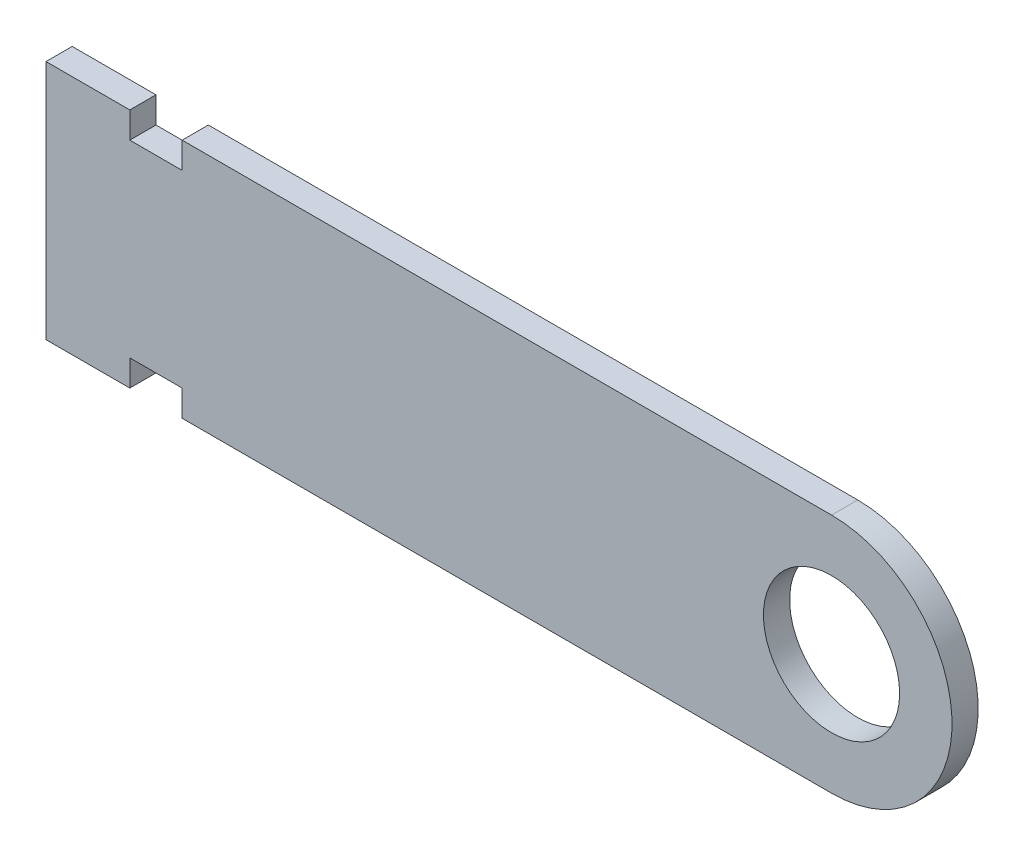
ISO-10303-21;
HEADER;
FILE_DESCRIPTION(('STEP AP214'),'2;1');
FILE_NAME('part.step','',(''),(''),'','','');
FILE_SCHEMA(('AUTOMOTIVE_DESIGN { 1 0 10303 214 1 1 1 1 }'));
ENDSEC;
DATA;
#1=APPLICATION_CONTEXT('core data for automotive mechanical design processes');
#2=APPLICATION_PROTOCOL_DEFINITION('international standard','automotive_design',2000,#1);
#3=PRODUCT_CONTEXT('',#1,'mechanical');
#4=PRODUCT('Part','Part','',(#3));
#5=PRODUCT_RELATED_PRODUCT_CATEGORY('part','',(#4));
#6=PRODUCT_DEFINITION_FORMATION('','',#4);
#7=PRODUCT_DEFINITION_CONTEXT('part definition',#1,'design');
#8=PRODUCT_DEFINITION('design','',#6,#7);
#9=PRODUCT_DEFINITION_SHAPE('','',#8);
#10=(LENGTH_UNIT() NAMED_UNIT(*) SI_UNIT(.MILLI.,.METRE.));
#11=(NAMED_UNIT(*) PLANE_ANGLE_UNIT() SI_UNIT($,.RADIAN.));
#12=(NAMED_UNIT(*) SI_UNIT($,.STERADIAN.) SOLID_ANGLE_UNIT());
#13=UNCERTAINTY_MEASURE_WITH_UNIT(LENGTH_MEASURE(1.E-05),#10,'distance_accuracy_value','');
#14=(GEOMETRIC_REPRESENTATION_CONTEXT(3) GLOBAL_UNCERTAINTY_ASSIGNED_CONTEXT((#13)) GLOBAL_UNIT_ASSIGNED_CONTEXT((#10,
#11,#12)) REPRESENTATION_CONTEXT('',''));
#15=CARTESIAN_POINT('',(0.,0.,0.));
#16=DIRECTION('',(0.,0.,1.));
#17=DIRECTION('',(1.,0.,0.));
#18=AXIS2_PLACEMENT_3D('',#15,#16,#17);
#19=CARTESIAN_POINT('',(0.,-23.,2.5));
#20=DIRECTION('',(0.,1.,0.));
#21=DIRECTION('',(0.,0.,1.));
#22=AXIS2_PLACEMENT_3D('',#19,#20,#21);
#23=PLANE('',#22);
#24=DIRECTION('',(1.,0.,0.));
#25=VECTOR('',#24,1.);
#26=CARTESIAN_POINT('',(0.,-23.,-2.5));
#27=LINE('',#26,#25);
#28=CARTESIAN_POINT('',(26.,-23.,-2.5));
#29=VERTEX_POINT('',#28);
#30=CARTESIAN_POINT('',(150.,-23.,-2.5));
#31=VERTEX_POINT('',#30);
#32=EDGE_CURVE('E165',#29,#31,#27,.T.);
#33=ORIENTED_EDGE('',*,*,#32,.T.);
#34=DIRECTION('',(0.,0.,-1.));
#35=VECTOR('',#34,1.);
#36=CARTESIAN_POINT('',(150.,-23.,2.5));
#37=LINE('',#36,#35);
#38=CARTESIAN_POINT('',(150.,-23.,2.5));
#39=VERTEX_POINT('',#38);
#40=EDGE_CURVE('E11',#39,#31,#37,.T.);
#41=ORIENTED_EDGE('',*,*,#40,.F.);
#42=DIRECTION('',(1.,0.,0.));
#43=VECTOR('',#42,1.);
#44=CARTESIAN_POINT('',(0.,-23.,2.5));
#45=LINE('',#44,#43);
#46=CARTESIAN_POINT('',(26.,-23.,2.5));
#47=VERTEX_POINT('',#46);
#48=EDGE_CURVE('E243',#47,#39,#45,.T.);
#49=ORIENTED_EDGE('',*,*,#48,.F.);
#50=DIRECTION('',(0.,0.,-1.));
#51=VECTOR('',#50,1.);
#52=CARTESIAN_POINT('',(26.,-23.,2.5));
#53=LINE('',#52,#51);
#54=EDGE_CURVE('E58',#47,#29,#53,.T.);
#55=ORIENTED_EDGE('',*,*,#54,.T.);
#56=EDGE_LOOP('',(#33,#41,#49,#55));
#57=FACE_BOUND('',#56,.T.);
#58=ADVANCED_FACE('F41',(#57),#23,.F.);
#59=CARTESIAN_POINT('',(150.,0.,2.5));
#60=DIRECTION('',(0.,0.,-1.));
#61=DIRECTION('',(-1.,0.,0.));
#62=AXIS2_PLACEMENT_3D('',#59,#60,#61);
#63=CYLINDRICAL_SURFACE('',#62,23.);
#64=CARTESIAN_POINT('',(150.,0.,-2.5));
#65=DIRECTION('',(0.,0.,1.));
#66=DIRECTION('',(1.,0.,0.));
#67=AXIS2_PLACEMENT_3D('',#64,#65,#66);
#68=CIRCLE('',#67,23.);
#69=CARTESIAN_POINT('',(150.,23.,-2.5));
#70=VERTEX_POINT('',#69);
#71=EDGE_CURVE('E167',#31,#70,#68,.T.);
#72=ORIENTED_EDGE('',*,*,#71,.T.);
#73=DIRECTION('',(0.,0.,-1.));
#74=VECTOR('',#73,1.);
#75=CARTESIAN_POINT('',(150.,23.,2.5));
#76=LINE('',#75,#74);
#77=CARTESIAN_POINT('',(150.,23.,2.5));
#78=VERTEX_POINT('',#77);
#79=EDGE_CURVE('E50',#78,#70,#76,.T.);
#80=ORIENTED_EDGE('',*,*,#79,.F.);
#81=CARTESIAN_POINT('',(150.,0.,2.5));
#82=DIRECTION('',(0.,0.,1.));
#83=DIRECTION('',(1.,0.,0.));
#84=AXIS2_PLACEMENT_3D('',#81,#82,#83);
#85=CIRCLE('',#84,23.);
#86=EDGE_CURVE('E108',#39,#78,#85,.T.);
#87=ORIENTED_EDGE('',*,*,#86,.F.);
#88=ORIENTED_EDGE('',*,*,#40,.T.);
#89=EDGE_LOOP('',(#72,#80,#87,#88));
#90=FACE_BOUND('',#89,.T.);
#91=ADVANCED_FACE('F214',(#90),#63,.T.);
#92=CARTESIAN_POINT('',(0.,23.,2.5));
#93=DIRECTION('',(0.,1.,0.));
#94=DIRECTION('',(0.,0.,1.));
#95=AXIS2_PLACEMENT_3D('',#92,#93,#94);
#96=PLANE('',#95);
#97=DIRECTION('',(1.,0.,0.));
#98=VECTOR('',#97,1.);
#99=CARTESIAN_POINT('',(0.,23.,-2.5));
#100=LINE('',#99,#98);
#101=CARTESIAN_POINT('',(26.,23.,-2.5));
#102=VERTEX_POINT('',#101);
#103=EDGE_CURVE('E171',#102,#70,#100,.T.);
#104=ORIENTED_EDGE('',*,*,#103,.F.);
#105=DIRECTION('',(0.,0.,-1.));
#106=VECTOR('',#105,1.);
#107=CARTESIAN_POINT('',(26.,23.,2.5));
#108=LINE('',#107,#106);
#109=CARTESIAN_POINT('',(26.,23.,2.5));
#110=VERTEX_POINT('',#109);
#111=EDGE_CURVE('E207',#110,#102,#108,.T.);
#112=ORIENTED_EDGE('',*,*,#111,.F.);
#113=DIRECTION('',(1.,0.,0.));
#114=VECTOR('',#113,1.);
#115=CARTESIAN_POINT('',(0.,23.,2.5));
#116=LINE('',#115,#114);
#117=EDGE_CURVE('E213',#110,#78,#116,.T.);
#118=ORIENTED_EDGE('',*,*,#117,.T.);
#119=ORIENTED_EDGE('',*,*,#79,.T.);
#120=EDGE_LOOP('',(#104,#112,#118,#119));
#121=FACE_BOUND('',#120,.T.);
#122=ADVANCED_FACE('F211',(#121),#96,.T.);
#123=CARTESIAN_POINT('',(26.,0.,2.5));
#124=DIRECTION('',(1.,0.,0.));
#125=DIRECTION('',(0.,0.,-1.));
#126=AXIS2_PLACEMENT_3D('',#123,#124,#125);
#127=PLANE('',#126);
#128=DIRECTION('',(0.,-1.,0.));
#129=VECTOR('',#128,1.);
#130=CARTESIAN_POINT('',(26.,0.,-2.5));
#131=LINE('',#130,#129);
#132=CARTESIAN_POINT('',(26.,18.,-2.5));
#133=VERTEX_POINT('',#132);
#134=EDGE_CURVE('E174',#102,#133,#131,.T.);
#135=ORIENTED_EDGE('',*,*,#134,.T.);
#136=DIRECTION('',(0.,0.,-1.));
#137=VECTOR('',#136,1.);
#138=CARTESIAN_POINT('',(26.,18.,2.5));
#139=LINE('',#138,#137);
#140=CARTESIAN_POINT('',(26.,18.,2.5));
#141=VERTEX_POINT('',#140);
#142=EDGE_CURVE('E204',#141,#133,#139,.T.);
#143=ORIENTED_EDGE('',*,*,#142,.F.);
#144=DIRECTION('',(0.,-1.,0.));
#145=VECTOR('',#144,1.);
#146=CARTESIAN_POINT('',(26.,0.,2.5));
#147=LINE('',#146,#145);
#148=EDGE_CURVE('E232',#110,#141,#147,.T.);
#149=ORIENTED_EDGE('',*,*,#148,.F.);
#150=ORIENTED_EDGE('',*,*,#111,.T.);
#151=EDGE_LOOP('',(#135,#143,#149,#150));
#152=FACE_BOUND('',#151,.T.);
#153=ADVANCED_FACE('F223',(#152),#127,.F.);
#154=CARTESIAN_POINT('',(0.,18.,2.5));
#155=DIRECTION('',(0.,-1.,0.));
#156=DIRECTION('',(0.,0.,-1.));
#157=AXIS2_PLACEMENT_3D('',#154,#155,#156);
#158=PLANE('',#157);
#159=DIRECTION('',(-1.,0.,0.));
#160=VECTOR('',#159,1.);
#161=CARTESIAN_POINT('',(0.,18.,-2.5));
#162=LINE('',#161,#160);
#163=CARTESIAN_POINT('',(16.,18.,-2.5));
#164=VERTEX_POINT('',#163);
#165=EDGE_CURVE('E177',#133,#164,#162,.T.);
#166=ORIENTED_EDGE('',*,*,#165,.T.);
#167=DIRECTION('',(0.,0.,-1.));
#168=VECTOR('',#167,1.);
#169=CARTESIAN_POINT('',(16.,18.,2.5));
#170=LINE('',#169,#168);
#171=CARTESIAN_POINT('',(16.,18.,2.5));
#172=VERTEX_POINT('',#171);
#173=EDGE_CURVE('E201',#172,#164,#170,.T.);
#174=ORIENTED_EDGE('',*,*,#173,.F.);
#175=DIRECTION('',(-1.,0.,0.));
#176=VECTOR('',#175,1.);
#177=CARTESIAN_POINT('',(0.,18.,2.5));
#178=LINE('',#177,#176);
#179=EDGE_CURVE('E229',#141,#172,#178,.T.);
#180=ORIENTED_EDGE('',*,*,#179,.F.);
#181=ORIENTED_EDGE('',*,*,#142,.T.);
#182=EDGE_LOOP('',(#166,#174,#180,#181));
#183=FACE_BOUND('',#182,.T.);
#184=ADVANCED_FACE('F227',(#183),#158,.F.);
#185=CARTESIAN_POINT('',(16.,0.,2.5));
#186=DIRECTION('',(-1.,0.,0.));
#187=DIRECTION('',(0.,-1.,0.));
#188=AXIS2_PLACEMENT_3D('',#185,#186,#187);
#189=PLANE('',#188);
#190=DIRECTION('',(0.,1.,0.));
#191=VECTOR('',#190,1.);
#192=CARTESIAN_POINT('',(16.,0.,-2.5));
#193=LINE('',#192,#191);
#194=CARTESIAN_POINT('',(16.,23.,-2.5));
#195=VERTEX_POINT('',#194);
#196=EDGE_CURVE('E179',#164,#195,#193,.T.);
#197=ORIENTED_EDGE('',*,*,#196,.T.);
#198=DIRECTION('',(0.,0.,-1.));
#199=VECTOR('',#198,1.);
#200=CARTESIAN_POINT('',(16.,23.,2.5));
#201=LINE('',#200,#199);
#202=CARTESIAN_POINT('',(16.,23.,2.5));
#203=VERTEX_POINT('',#202);
#204=EDGE_CURVE('E199',#203,#195,#201,.T.);
#205=ORIENTED_EDGE('',*,*,#204,.F.);
#206=DIRECTION('',(0.,1.,0.));
#207=VECTOR('',#206,1.);
#208=CARTESIAN_POINT('',(16.,0.,2.5));
#209=LINE('',#208,#207);
#210=EDGE_CURVE('E231',#172,#203,#209,.T.);
#211=ORIENTED_EDGE('',*,*,#210,.F.);
#212=ORIENTED_EDGE('',*,*,#173,.T.);
#213=EDGE_LOOP('',(#197,#205,#211,#212));
#214=FACE_BOUND('',#213,.T.);
#215=ADVANCED_FACE('F287',(#214),#189,.F.);
#216=CARTESIAN_POINT('',(0.,23.,-2.5));
#217=VERTEX_POINT('',#216);
#218=EDGE_CURVE('E175',#217,#195,#100,.T.);
#219=ORIENTED_EDGE('',*,*,#218,.F.);
#220=DIRECTION('',(0.,0.,-1.));
#221=VECTOR('',#220,1.);
#222=CARTESIAN_POINT('',(0.,23.,2.5));
#223=LINE('',#222,#221);
#224=CARTESIAN_POINT('',(0.,23.,2.5));
#225=VERTEX_POINT('',#224);
#226=EDGE_CURVE('E197',#225,#217,#223,.T.);
#227=ORIENTED_EDGE('',*,*,#226,.F.);
#228=EDGE_CURVE('E234',#225,#203,#116,.T.);
#229=ORIENTED_EDGE('',*,*,#228,.T.);
#230=ORIENTED_EDGE('',*,*,#204,.T.);
#231=EDGE_LOOP('',(#219,#227,#229,#230));
#232=FACE_BOUND('',#231,.T.);
#233=ADVANCED_FACE('F278',(#232),#96,.T.);
#234=CARTESIAN_POINT('',(0.,0.,2.5));
#235=DIRECTION('',(1.,0.,0.));
#236=DIRECTION('',(0.,0.,-1.));
#237=AXIS2_PLACEMENT_3D('',#234,#235,#236);
#238=PLANE('',#237);
#239=DIRECTION('',(0.,-1.,0.));
#240=VECTOR('',#239,1.);
#241=CARTESIAN_POINT('',(0.,0.,-2.5));
#242=LINE('',#241,#240);
#243=CARTESIAN_POINT('',(0.,-23.,-2.5));
#244=VERTEX_POINT('',#243);
#245=EDGE_CURVE('E182',#217,#244,#242,.T.);
#246=ORIENTED_EDGE('',*,*,#245,.T.);
#247=DIRECTION('',(0.,0.,-1.));
#248=VECTOR('',#247,1.);
#249=CARTESIAN_POINT('',(0.,-23.,2.5));
#250=LINE('',#249,#248);
#251=CARTESIAN_POINT('',(0.,-23.,2.5));
#252=VERTEX_POINT('',#251);
#253=EDGE_CURVE('E194',#252,#244,#250,.T.);
#254=ORIENTED_EDGE('',*,*,#253,.F.);
#255=DIRECTION('',(0.,-1.,0.));
#256=VECTOR('',#255,1.);
#257=CARTESIAN_POINT('',(0.,0.,2.5));
#258=LINE('',#257,#256);
#259=EDGE_CURVE('E238',#225,#252,#258,.T.);
#260=ORIENTED_EDGE('',*,*,#259,.F.);
#261=ORIENTED_EDGE('',*,*,#226,.T.);
#262=EDGE_LOOP('',(#246,#254,#260,#261));
#263=FACE_BOUND('',#262,.T.);
#264=ADVANCED_FACE('F272',(#263),#238,.F.);
#265=CARTESIAN_POINT('',(16.,-23.,-2.5));
#266=VERTEX_POINT('',#265);
#267=EDGE_CURVE('E168',#244,#266,#27,.T.);
#268=ORIENTED_EDGE('',*,*,#267,.T.);
#269=DIRECTION('',(0.,0.,-1.));
#270=VECTOR('',#269,1.);
#271=CARTESIAN_POINT('',(16.,-23.,2.5));
#272=LINE('',#271,#270);
#273=CARTESIAN_POINT('',(16.,-23.,2.5));
#274=VERTEX_POINT('',#273);
#275=EDGE_CURVE('E145',#274,#266,#272,.T.);
#276=ORIENTED_EDGE('',*,*,#275,.F.);
#277=EDGE_CURVE('E153',#252,#274,#45,.T.);
#278=ORIENTED_EDGE('',*,*,#277,.F.);
#279=ORIENTED_EDGE('',*,*,#253,.T.);
#280=EDGE_LOOP('',(#268,#276,#278,#279));
#281=FACE_BOUND('',#280,.T.);
#282=ADVANCED_FACE('F265',(#281),#23,.F.);
#283=CARTESIAN_POINT('',(16.,0.,2.5));
#284=DIRECTION('',(1.,0.,0.));
#285=DIRECTION('',(0.,1.,0.));
#286=AXIS2_PLACEMENT_3D('',#283,#284,#285);
#287=PLANE('',#286);
#288=DIRECTION('',(0.,-1.,0.));
#289=VECTOR('',#288,1.);
#290=CARTESIAN_POINT('',(16.,0.,-2.5));
#291=LINE('',#290,#289);
#292=CARTESIAN_POINT('',(16.,-18.,-2.5));
#293=VERTEX_POINT('',#292);
#294=EDGE_CURVE('E141',#293,#266,#291,.T.);
#295=ORIENTED_EDGE('',*,*,#294,.F.);
#296=DIRECTION('',(0.,0.,-1.));
#297=VECTOR('',#296,1.);
#298=CARTESIAN_POINT('',(16.,-18.,2.5));
#299=LINE('',#298,#297);
#300=CARTESIAN_POINT('',(16.,-18.,2.5));
#301=VERTEX_POINT('',#300);
#302=EDGE_CURVE('E136',#301,#293,#299,.T.);
#303=ORIENTED_EDGE('',*,*,#302,.F.);
#304=DIRECTION('',(0.,-1.,0.));
#305=VECTOR('',#304,1.);
#306=CARTESIAN_POINT('',(16.,0.,2.5));
#307=LINE('',#306,#305);
#308=EDGE_CURVE('E139',#301,#274,#307,.T.);
#309=ORIENTED_EDGE('',*,*,#308,.T.);
#310=ORIENTED_EDGE('',*,*,#275,.T.);
#311=EDGE_LOOP('',(#295,#303,#309,#310));
#312=FACE_BOUND('',#311,.T.);
#313=ADVANCED_FACE('F138',(#312),#287,.T.);
#314=CARTESIAN_POINT('',(0.,-18.,2.5));
#315=DIRECTION('',(0.,-1.,0.));
#316=DIRECTION('',(0.,0.,-1.));
#317=AXIS2_PLACEMENT_3D('',#314,#315,#316);
#318=PLANE('',#317);
#319=DIRECTION('',(-1.,0.,0.));
#320=VECTOR('',#319,1.);
#321=CARTESIAN_POINT('',(0.,-18.,-2.5));
#322=LINE('',#321,#320);
#323=CARTESIAN_POINT('',(26.,-18.,-2.5));
#324=VERTEX_POINT('',#323);
#325=EDGE_CURVE('E185',#324,#293,#322,.T.);
#326=ORIENTED_EDGE('',*,*,#325,.F.);
#327=DIRECTION('',(0.,0.,-1.));
#328=VECTOR('',#327,1.);
#329=CARTESIAN_POINT('',(26.,-18.,2.5));
#330=LINE('',#329,#328);
#331=CARTESIAN_POINT('',(26.,-18.,2.5));
#332=VERTEX_POINT('',#331);
#333=EDGE_CURVE('E96',#332,#324,#330,.T.);
#334=ORIENTED_EDGE('',*,*,#333,.F.);
#335=DIRECTION('',(-1.,0.,0.));
#336=VECTOR('',#335,1.);
#337=CARTESIAN_POINT('',(0.,-18.,2.5));
#338=LINE('',#337,#336);
#339=EDGE_CURVE('E151',#332,#301,#338,.T.);
#340=ORIENTED_EDGE('',*,*,#339,.T.);
#341=ORIENTED_EDGE('',*,*,#302,.T.);
#342=EDGE_LOOP('',(#326,#334,#340,#341));
#343=FACE_BOUND('',#342,.T.);
#344=ADVANCED_FACE('F156',(#343),#318,.T.);
#345=CARTESIAN_POINT('',(150.,0.,2.5));
#346=DIRECTION('',(0.,0.,-1.));
#347=DIRECTION('',(-1.,0.,0.));
#348=AXIS2_PLACEMENT_3D('',#345,#346,#347);
#349=CYLINDRICAL_SURFACE('',#348,13.);
#350=CARTESIAN_POINT('',(150.,0.,2.5));
#351=DIRECTION('',(0.,0.,1.));
#352=DIRECTION('',(1.,0.,0.));
#353=AXIS2_PLACEMENT_3D('',#350,#351,#352);
#354=CIRCLE('',#353,13.);
#355=CARTESIAN_POINT('',(163.,0.,2.5));
#356=VERTEX_POINT('',#355);
#357=EDGE_CURVE('E190',#356,#356,#354,.T.);
#358=ORIENTED_EDGE('',*,*,#357,.T.);
#359=EDGE_LOOP('',(#358));
#360=FACE_BOUND('',#359,.T.);
#361=CARTESIAN_POINT('',(150.,0.,-2.5));
#362=DIRECTION('',(0.,0.,1.));
#363=DIRECTION('',(1.,0.,0.));
#364=AXIS2_PLACEMENT_3D('',#361,#362,#363);
#365=CIRCLE('',#364,13.);
#366=CARTESIAN_POINT('',(163.,0.,-2.5));
#367=VERTEX_POINT('',#366);
#368=EDGE_CURVE('E162',#367,#367,#365,.T.);
#369=ORIENTED_EDGE('',*,*,#368,.F.);
#370=EDGE_LOOP('',(#369));
#371=FACE_BOUND('',#370,.T.);
#372=ADVANCED_FACE('F43',(#360,#371),#349,.F.);
#373=CARTESIAN_POINT('',(26.,0.,2.5));
#374=DIRECTION('',(-1.,0.,0.));
#375=DIRECTION('',(0.,0.,1.));
#376=AXIS2_PLACEMENT_3D('',#373,#374,#375);
#377=PLANE('',#376);
#378=DIRECTION('',(0.,1.,0.));
#379=VECTOR('',#378,1.);
#380=CARTESIAN_POINT('',(26.,0.,-2.5));
#381=LINE('',#380,#379);
#382=EDGE_CURVE('E187',#29,#324,#381,.T.);
#383=ORIENTED_EDGE('',*,*,#382,.F.);
#384=ORIENTED_EDGE('',*,*,#54,.F.);
#385=DIRECTION('',(0.,1.,0.));
#386=VECTOR('',#385,1.);
#387=CARTESIAN_POINT('',(26.,0.,2.5));
#388=LINE('',#387,#386);
#389=EDGE_CURVE('E157',#47,#332,#388,.T.);
#390=ORIENTED_EDGE('',*,*,#389,.T.);
#391=ORIENTED_EDGE('',*,*,#333,.T.);
#392=EDGE_LOOP('',(#383,#384,#390,#391));
#393=FACE_BOUND('',#392,.T.);
#394=ADVANCED_FACE('F254',(#393),#377,.T.);
#395=CARTESIAN_POINT('',(0.,0.,2.5));
#396=DIRECTION('',(0.,0.,1.));
#397=DIRECTION('',(1.,0.,0.));
#398=AXIS2_PLACEMENT_3D('',#395,#396,#397);
#399=PLANE('',#398);
#400=ORIENTED_EDGE('',*,*,#357,.F.);
#401=EDGE_LOOP('',(#400));
#402=FACE_BOUND('',#401,.T.);
#403=ORIENTED_EDGE('',*,*,#48,.T.);
#404=ORIENTED_EDGE('',*,*,#86,.T.);
#405=ORIENTED_EDGE('',*,*,#117,.F.);
#406=ORIENTED_EDGE('',*,*,#148,.T.);
#407=ORIENTED_EDGE('',*,*,#179,.T.);
#408=ORIENTED_EDGE('',*,*,#210,.T.);
#409=ORIENTED_EDGE('',*,*,#228,.F.);
#410=ORIENTED_EDGE('',*,*,#259,.T.);
#411=ORIENTED_EDGE('',*,*,#277,.T.);
#412=ORIENTED_EDGE('',*,*,#308,.F.);
#413=ORIENTED_EDGE('',*,*,#339,.F.);
#414=ORIENTED_EDGE('',*,*,#389,.F.);
#415=EDGE_LOOP('',(#403,#404,#405,#406,#407,#408,#409,#410,#411,#412,#413,#414));
#416=FACE_BOUND('',#415,.T.);
#417=ADVANCED_FACE('F149',(#402,#416),#399,.T.);
#418=CARTESIAN_POINT('',(0.,0.,-2.5));
#419=DIRECTION('',(0.,0.,1.));
#420=DIRECTION('',(1.,0.,0.));
#421=AXIS2_PLACEMENT_3D('',#418,#419,#420);
#422=PLANE('',#421);
#423=ORIENTED_EDGE('',*,*,#368,.T.);
#424=EDGE_LOOP('',(#423));
#425=FACE_BOUND('',#424,.T.);
#426=ORIENTED_EDGE('',*,*,#32,.F.);
#427=ORIENTED_EDGE('',*,*,#382,.T.);
#428=ORIENTED_EDGE('',*,*,#325,.T.);
#429=ORIENTED_EDGE('',*,*,#294,.T.);
#430=ORIENTED_EDGE('',*,*,#267,.F.);
#431=ORIENTED_EDGE('',*,*,#245,.F.);
#432=ORIENTED_EDGE('',*,*,#218,.T.);
#433=ORIENTED_EDGE('',*,*,#196,.F.);
#434=ORIENTED_EDGE('',*,*,#165,.F.);
#435=ORIENTED_EDGE('',*,*,#134,.F.);
#436=ORIENTED_EDGE('',*,*,#103,.T.);
#437=ORIENTED_EDGE('',*,*,#71,.F.);
#438=EDGE_LOOP('',(#426,#427,#428,#429,#430,#431,#432,#433,#434,#435,#436,#437));
#439=FACE_BOUND('',#438,.T.);
#440=ADVANCED_FACE('F218',(#425,#439),#422,.F.);
#441=CLOSED_SHELL('',(#58,#91,#122,#153,#184,#215,#233,#264,#282,#313,#344,#372,#394,#417,#440));
#442=MANIFOLD_SOLID_BREP('B2',#441);
#443=ADVANCED_BREP_SHAPE_REPRESENTATION('',(#18,#442),#14);
#444=SHAPE_DEFINITION_REPRESENTATION(#9,#443);
ENDSEC;
END-ISO-10303-21;
